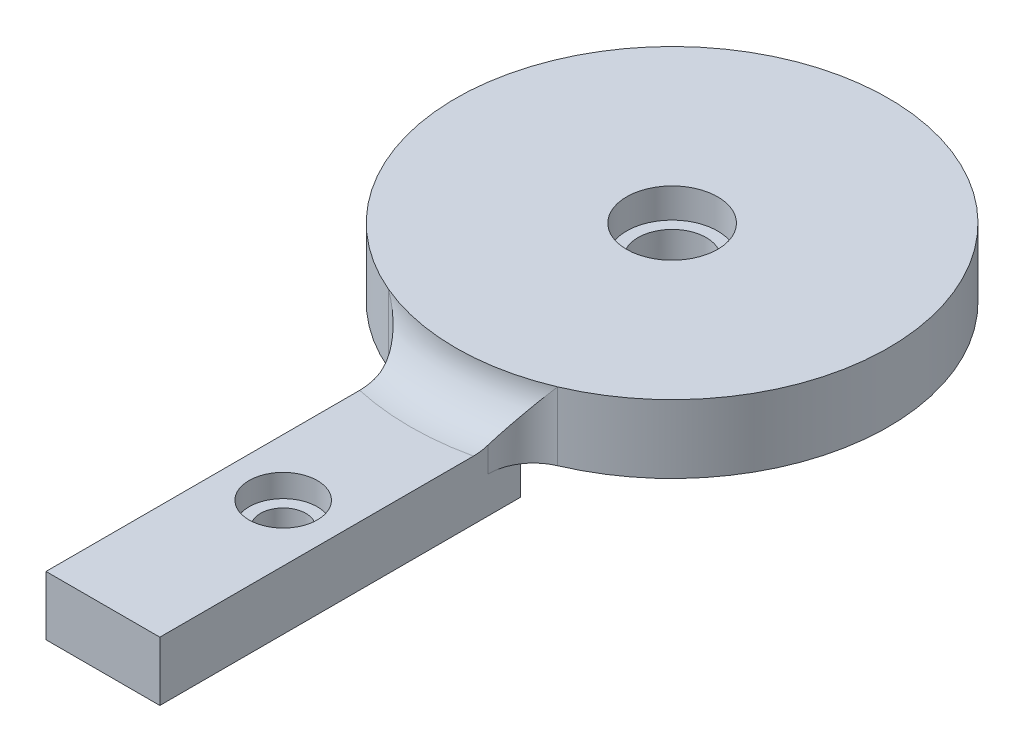
ISO-10303-21;
HEADER;
FILE_DESCRIPTION(('STEP AP214'),'2;1');
FILE_NAME('part.step','',(''),(''),'','','');
FILE_SCHEMA(('AUTOMOTIVE_DESIGN { 1 0 10303 214 1 1 1 1 }'));
ENDSEC;
DATA;
#1=APPLICATION_CONTEXT('core data for automotive mechanical design processes');
#2=APPLICATION_PROTOCOL_DEFINITION('international standard','automotive_design',2000,#1);
#3=PRODUCT_CONTEXT('',#1,'mechanical');
#4=PRODUCT('Part','Part','',(#3));
#5=PRODUCT_RELATED_PRODUCT_CATEGORY('part','',(#4));
#6=PRODUCT_DEFINITION_FORMATION('','',#4);
#7=PRODUCT_DEFINITION_CONTEXT('part definition',#1,'design');
#8=PRODUCT_DEFINITION('design','',#6,#7);
#9=PRODUCT_DEFINITION_SHAPE('','',#8);
#10=(LENGTH_UNIT() NAMED_UNIT(*) SI_UNIT(.MILLI.,.METRE.));
#11=(NAMED_UNIT(*) PLANE_ANGLE_UNIT() SI_UNIT($,.RADIAN.));
#12=(NAMED_UNIT(*) SI_UNIT($,.STERADIAN.) SOLID_ANGLE_UNIT());
#13=UNCERTAINTY_MEASURE_WITH_UNIT(LENGTH_MEASURE(1.E-05),#10,'distance_accuracy_value','');
#14=(GEOMETRIC_REPRESENTATION_CONTEXT(3) GLOBAL_UNCERTAINTY_ASSIGNED_CONTEXT((#13)) GLOBAL_UNIT_ASSIGNED_CONTEXT((#10,
#11,#12)) REPRESENTATION_CONTEXT('',''));
#15=CARTESIAN_POINT('',(0.,0.,0.));
#16=DIRECTION('',(0.,0.,1.));
#17=DIRECTION('',(1.,0.,0.));
#18=AXIS2_PLACEMENT_3D('',#15,#16,#17);
#19=CARTESIAN_POINT('',(0.,3.,0.));
#20=DIRECTION('',(0.,-1.,0.));
#21=DIRECTION('',(0.,0.,-1.));
#22=AXIS2_PLACEMENT_3D('',#19,#20,#21);
#23=CYLINDRICAL_SURFACE('',#22,9.5);
#24=CARTESIAN_POINT('',(0.,3.,0.));
#25=DIRECTION('',(0.,1.,0.));
#26=DIRECTION('',(0.,0.,1.));
#27=AXIS2_PLACEMENT_3D('',#24,#25,#26);
#28=CIRCLE('',#27,9.5);
#29=CARTESIAN_POINT('',(3.71739130434783,3.,8.742482593083));
#30=VERTEX_POINT('',#29);
#31=CARTESIAN_POINT('',(-3.71739130434783,3.,8.742482593083));
#32=VERTEX_POINT('',#31);
#33=EDGE_CURVE('E158',#30,#32,#28,.T.);
#34=ORIENTED_EDGE('',*,*,#33,.F.);
#35=DIRECTION('',(0.,-1.,0.));
#36=VECTOR('',#35,1.);
#37=CARTESIAN_POINT('',(3.71739130434783,3.,8.742482593083));
#38=LINE('',#37,#36);
#39=CARTESIAN_POINT('',(3.71739130434783,0.,8.742482593083));
#40=VERTEX_POINT('',#39);
#41=EDGE_CURVE('E237',#30,#40,#38,.T.);
#42=ORIENTED_EDGE('',*,*,#41,.T.);
#43=CARTESIAN_POINT('',(0.,0.,0.));
#44=DIRECTION('',(0.,1.,0.));
#45=DIRECTION('',(0.,0.,1.));
#46=AXIS2_PLACEMENT_3D('',#43,#44,#45);
#47=CIRCLE('',#46,9.5);
#48=CARTESIAN_POINT('',(-3.71739130434783,0.,8.742482593083));
#49=VERTEX_POINT('',#48);
#50=EDGE_CURVE('E163',#40,#49,#47,.T.);
#51=ORIENTED_EDGE('',*,*,#50,.T.);
#52=DIRECTION('',(0.,-1.,0.));
#53=VECTOR('',#52,1.);
#54=CARTESIAN_POINT('',(-3.71739130434783,3.,8.742482593083));
#55=LINE('',#54,#53);
#56=EDGE_CURVE('E240',#49,#32,#55,.F.);
#57=ORIENTED_EDGE('',*,*,#56,.T.);
#58=EDGE_LOOP('',(#34,#42,#51,#57));
#59=FACE_BOUND('',#58,.T.);
#60=ADVANCED_FACE('F41',(#59),#23,.T.);
#61=CARTESIAN_POINT('',(0.,3.,0.));
#62=DIRECTION('',(0.,1.,0.));
#63=DIRECTION('',(0.,0.,1.));
#64=AXIS2_PLACEMENT_3D('',#61,#62,#63);
#65=PLANE('',#64);
#66=CARTESIAN_POINT('',(0.,3.,0.));
#67=DIRECTION('',(0.,1.,0.));
#68=DIRECTION('',(0.,0.,1.));
#69=AXIS2_PLACEMENT_3D('',#66,#67,#68);
#70=CIRCLE('',#69,2.);
#71=CARTESIAN_POINT('',(0.,3.,2.));
#72=VERTEX_POINT('',#71);
#73=EDGE_CURVE('E137',#72,#72,#70,.T.);
#74=ORIENTED_EDGE('',*,*,#73,.F.);
#75=EDGE_LOOP('',(#74));
#76=FACE_BOUND('',#75,.T.);
#77=EDGE_CURVE('E162',#32,#30,#28,.T.);
#78=ORIENTED_EDGE('',*,*,#77,.T.);
#79=ORIENTED_EDGE('',*,*,#33,.T.);
#80=EDGE_LOOP('',(#78,#79));
#81=FACE_BOUND('',#80,.T.);
#82=ADVANCED_FACE('F222',(#76,#81),#65,.T.);
#83=CARTESIAN_POINT('',(0.,0.,0.));
#84=DIRECTION('',(0.,1.,0.));
#85=DIRECTION('',(0.,0.,1.));
#86=AXIS2_PLACEMENT_3D('',#83,#84,#85);
#87=PLANE('',#86);
#88=CARTESIAN_POINT('',(0.,0.,0.));
#89=DIRECTION('',(0.,-1.,0.));
#90=DIRECTION('',(0.,0.,-1.));
#91=AXIS2_PLACEMENT_3D('',#88,#89,#90);
#92=CIRCLE('',#91,7.6);
#93=CARTESIAN_POINT('',(0.,0.,-7.6));
#94=VERTEX_POINT('',#93);
#95=EDGE_CURVE('E117',#94,#94,#92,.T.);
#96=ORIENTED_EDGE('',*,*,#95,.F.);
#97=EDGE_LOOP('',(#96));
#98=FACE_BOUND('',#97,.T.);
#99=ORIENTED_EDGE('',*,*,#50,.F.);
#100=CARTESIAN_POINT('',(4.5,0.,10.5830052442584));
#101=DIRECTION('',(0.,1.,0.));
#102=DIRECTION('',(0.,0.,1.));
#103=AXIS2_PLACEMENT_3D('',#100,#101,#102);
#104=CIRCLE('',#103,2.);
#105=CARTESIAN_POINT('',(2.5,0.,10.5830052442584));
#106=VERTEX_POINT('',#105);
#107=EDGE_CURVE('E251',#40,#106,#104,.T.);
#108=ORIENTED_EDGE('',*,*,#107,.T.);
#109=DIRECTION('',(0.,0.,1.));
#110=VECTOR('',#109,1.);
#111=CARTESIAN_POINT('',(2.5,0.,0.));
#112=LINE('',#111,#110);
#113=CARTESIAN_POINT('',(2.5,0.,9.16515138991168));
#114=VERTEX_POINT('',#113);
#115=EDGE_CURVE('E59',#114,#106,#112,.T.);
#116=ORIENTED_EDGE('',*,*,#115,.F.);
#117=CARTESIAN_POINT('',(-2.5,0.,9.16515138991168));
#118=VERTEX_POINT('',#117);
#119=EDGE_CURVE('E115',#118,#114,#47,.T.);
#120=ORIENTED_EDGE('',*,*,#119,.F.);
#121=DIRECTION('',(0.,0.,-1.));
#122=VECTOR('',#121,1.);
#123=CARTESIAN_POINT('',(-2.5,0.,0.));
#124=LINE('',#123,#122);
#125=CARTESIAN_POINT('',(-2.5,0.,10.5830052442584));
#126=VERTEX_POINT('',#125);
#127=EDGE_CURVE('E256',#126,#118,#124,.T.);
#128=ORIENTED_EDGE('',*,*,#127,.F.);
#129=CARTESIAN_POINT('',(-4.5,0.,10.5830052442584));
#130=DIRECTION('',(0.,1.,0.));
#131=DIRECTION('',(0.,0.,1.));
#132=AXIS2_PLACEMENT_3D('',#129,#130,#131);
#133=CIRCLE('',#132,2.);
#134=EDGE_CURVE('E11',#126,#49,#133,.T.);
#135=ORIENTED_EDGE('',*,*,#134,.T.);
#136=EDGE_LOOP('',(#99,#108,#116,#120,#128,#135));
#137=FACE_BOUND('',#136,.T.);
#138=ADVANCED_FACE('F220',(#98,#137),#87,.F.);
#139=CARTESIAN_POINT('',(0.,0.5,0.));
#140=DIRECTION('',(0.,-1.,0.));
#141=DIRECTION('',(0.,0.,-1.));
#142=AXIS2_PLACEMENT_3D('',#139,#140,#141);
#143=CYLINDRICAL_SURFACE('',#142,7.6);
#144=CARTESIAN_POINT('',(0.,0.5,0.));
#145=DIRECTION('',(0.,-1.,0.));
#146=DIRECTION('',(0.,0.,-1.));
#147=AXIS2_PLACEMENT_3D('',#144,#145,#146);
#148=CIRCLE('',#147,7.6);
#149=CARTESIAN_POINT('',(0.,0.5,-7.6));
#150=VERTEX_POINT('',#149);
#151=EDGE_CURVE('E153',#150,#150,#148,.T.);
#152=ORIENTED_EDGE('',*,*,#151,.F.);
#153=EDGE_LOOP('',(#152));
#154=FACE_BOUND('',#153,.T.);
#155=ORIENTED_EDGE('',*,*,#95,.T.);
#156=EDGE_LOOP('',(#155));
#157=FACE_BOUND('',#156,.T.);
#158=ADVANCED_FACE('F216',(#154,#157),#143,.F.);
#159=CARTESIAN_POINT('',(0.,0.5,0.));
#160=DIRECTION('',(0.,-1.,0.));
#161=DIRECTION('',(0.,0.,-1.));
#162=AXIS2_PLACEMENT_3D('',#159,#160,#161);
#163=PLANE('',#162);
#164=CARTESIAN_POINT('',(0.,0.5,0.));
#165=DIRECTION('',(0.,-1.,0.));
#166=DIRECTION('',(0.,0.,-1.));
#167=AXIS2_PLACEMENT_3D('',#164,#165,#166);
#168=CIRCLE('',#167,1.5);
#169=CARTESIAN_POINT('',(0.,0.5,-1.5));
#170=VERTEX_POINT('',#169);
#171=EDGE_CURVE('E169',#170,#170,#168,.T.);
#172=ORIENTED_EDGE('',*,*,#171,.F.);
#173=EDGE_LOOP('',(#172));
#174=FACE_BOUND('',#173,.T.);
#175=ORIENTED_EDGE('',*,*,#151,.T.);
#176=EDGE_LOOP('',(#175));
#177=FACE_BOUND('',#176,.T.);
#178=ADVANCED_FACE('F213',(#174,#177),#163,.T.);
#179=CARTESIAN_POINT('',(0.,-1.6,0.));
#180=DIRECTION('',(0.,1.,0.));
#181=DIRECTION('',(0.,0.,1.));
#182=AXIS2_PLACEMENT_3D('',#179,#180,#181);
#183=CYLINDRICAL_SURFACE('',#182,9.5);
#184=ORIENTED_EDGE('',*,*,#119,.T.);
#185=DIRECTION('',(0.,1.,0.));
#186=VECTOR('',#185,1.);
#187=CARTESIAN_POINT('',(2.5,-1.6,9.16515138991168));
#188=LINE('',#187,#186);
#189=CARTESIAN_POINT('',(2.5,-1.6,9.16515138991168));
#190=VERTEX_POINT('',#189);
#191=EDGE_CURVE('E108',#190,#114,#188,.T.);
#192=ORIENTED_EDGE('',*,*,#191,.F.);
#193=CARTESIAN_POINT('',(0.,-1.6,0.));
#194=DIRECTION('',(0.,-1.,0.));
#195=DIRECTION('',(0.,0.,-1.));
#196=AXIS2_PLACEMENT_3D('',#193,#194,#195);
#197=CIRCLE('',#196,9.5);
#198=CARTESIAN_POINT('',(-2.5,-1.6,9.16515138991168));
#199=VERTEX_POINT('',#198);
#200=EDGE_CURVE('E113',#190,#199,#197,.T.);
#201=ORIENTED_EDGE('',*,*,#200,.T.);
#202=DIRECTION('',(0.,1.,0.));
#203=VECTOR('',#202,1.);
#204=CARTESIAN_POINT('',(-2.5,-1.6,9.16515138991168));
#205=LINE('',#204,#203);
#206=EDGE_CURVE('E142',#199,#118,#205,.T.);
#207=ORIENTED_EDGE('',*,*,#206,.T.);
#208=EDGE_LOOP('',(#184,#192,#201,#207));
#209=FACE_BOUND('',#208,.T.);
#210=ADVANCED_FACE('F110',(#209),#183,.F.);
#211=CARTESIAN_POINT('',(2.5,-1.6,0.));
#212=DIRECTION('',(-1.,0.,0.));
#213=DIRECTION('',(0.,0.,1.));
#214=AXIS2_PLACEMENT_3D('',#211,#212,#213);
#215=PLANE('',#214);
#216=ORIENTED_EDGE('',*,*,#115,.T.);
#217=DIRECTION('',(0.,1.,0.));
#218=VECTOR('',#217,1.);
#219=CARTESIAN_POINT('',(2.5,3.,10.5830052442584));
#220=LINE('',#219,#218);
#221=CARTESIAN_POINT('',(2.5,1.10040097238581,10.5830052442584));
#222=VERTEX_POINT('',#221);
#223=EDGE_CURVE('E259',#106,#222,#220,.T.);
#224=ORIENTED_EDGE('',*,*,#223,.T.);
#225=CARTESIAN_POINT('',(2.5,3.,9.16515138991168));
#226=CARTESIAN_POINT('',(2.5,2.94507948967621,9.16515048175511));
#227=CARTESIAN_POINT('',(2.5,2.89018591560524,9.16749780190774));
#228=CARTESIAN_POINT('',(2.5,2.78080468785167,9.17685365674659));
#229=CARTESIAN_POINT('',(2.5,2.72631698136846,9.18386157402017));
#230=CARTESIAN_POINT('',(2.5,2.56426323291039,9.21177358475455));
#231=CARTESIAN_POINT('',(2.5,2.45780396812137,9.23956638078001));
#232=CARTESIAN_POINT('',(2.5,2.25109972983604,9.31256230521273));
#233=CARTESIAN_POINT('',(2.5,2.1508551906533,9.3577666488302));
#234=CARTESIAN_POINT('',(2.5,1.95917981073917,9.46409101336274));
#235=CARTESIAN_POINT('',(2.5,1.86775031263618,9.52521345354943));
#236=CARTESIAN_POINT('',(2.5,1.6945785857672,9.6626335108321));
#237=CARTESIAN_POINT('',(2.5,1.61302674270591,9.73917070309158));
#238=CARTESIAN_POINT('',(2.5,1.46342673767224,9.90448170829992));
#239=CARTESIAN_POINT('',(2.5,1.39538216234534,9.99325876077783));
#240=CARTESIAN_POINT('',(2.5,1.27246764110905,10.1835802398452));
#241=CARTESIAN_POINT('',(2.5,1.21809120196434,10.2854432186382));
#242=CARTESIAN_POINT('',(2.5,1.12679127317599,10.496696281118));
#243=CARTESIAN_POINT('',(2.5,1.08986292590693,10.6060842600846));
#244=CARTESIAN_POINT('',(2.5,1.04150387807019,10.8006361748785));
#245=CARTESIAN_POINT('',(2.5,1.02595979460194,10.884802842851));
#246=CARTESIAN_POINT('',(2.5,1.00520657592899,11.0542933628545));
#247=CARTESIAN_POINT('',(2.5,0.999984556889041,11.1396156382978));
#248=CARTESIAN_POINT('',(2.5,1.,11.2249721603218));
#249=B_SPLINE_CURVE_WITH_KNOTS('',3,(#225,#226,#227,#228,#229,#230,#231,#232,#233,#234,#235,
#236,#237,#238,#239,#240,#241,#242,#243,#244,#245,#246,#247,#248),.UNSPECIFIED.,.F.,.F.,(4,2,2,
2,2,2,2,2,2,2,2,4),(0.,0.164658231389705,0.329294654022611,0.657671501485732,0.986071271622932,
1.31452098192498,1.64853582294687,1.9826392381368,2.32747665339377,2.67221800774815,
2.92838367390356,3.18422939576872),.UNSPECIFIED.);
#250=CARTESIAN_POINT('',(2.5,1.,11.2249721603218));
#251=VERTEX_POINT('',#250);
#252=EDGE_CURVE('E187',#222,#251,#249,.T.);
#253=ORIENTED_EDGE('',*,*,#252,.T.);
#254=DIRECTION('',(0.,0.,1.));
#255=VECTOR('',#254,1.);
#256=CARTESIAN_POINT('',(2.5,1.,0.));
#257=LINE('',#256,#255);
#258=CARTESIAN_POINT('',(2.5,1.,25.));
#259=VERTEX_POINT('',#258);
#260=EDGE_CURVE('E143',#251,#259,#257,.T.);
#261=ORIENTED_EDGE('',*,*,#260,.T.);
#262=DIRECTION('',(0.,1.,0.));
#263=VECTOR('',#262,1.);
#264=CARTESIAN_POINT('',(2.5,-1.6,25.));
#265=LINE('',#264,#263);
#266=CARTESIAN_POINT('',(2.5,-1.6,25.));
#267=VERTEX_POINT('',#266);
#268=EDGE_CURVE('E118',#267,#259,#265,.T.);
#269=ORIENTED_EDGE('',*,*,#268,.F.);
#270=DIRECTION('',(0.,0.,1.));
#271=VECTOR('',#270,1.);
#272=CARTESIAN_POINT('',(2.5,-1.6,0.));
#273=LINE('',#272,#271);
#274=EDGE_CURVE('E121',#190,#267,#273,.T.);
#275=ORIENTED_EDGE('',*,*,#274,.F.);
#276=ORIENTED_EDGE('',*,*,#191,.T.);
#277=EDGE_LOOP('',(#216,#224,#253,#261,#269,#275,#276));
#278=FACE_BOUND('',#277,.T.);
#279=ADVANCED_FACE('F122',(#278),#215,.F.);
#280=CARTESIAN_POINT('',(0.,-1.6,25.));
#281=DIRECTION('',(0.,0.,1.));
#282=DIRECTION('',(1.,0.,0.));
#283=AXIS2_PLACEMENT_3D('',#280,#281,#282);
#284=PLANE('',#283);
#285=DIRECTION('',(1.,0.,0.));
#286=VECTOR('',#285,1.);
#287=CARTESIAN_POINT('',(0.,1.,25.));
#288=LINE('',#287,#286);
#289=CARTESIAN_POINT('',(-2.5,1.,25.));
#290=VERTEX_POINT('',#289);
#291=EDGE_CURVE('E134',#290,#259,#288,.T.);
#292=ORIENTED_EDGE('',*,*,#291,.F.);
#293=DIRECTION('',(0.,1.,0.));
#294=VECTOR('',#293,1.);
#295=CARTESIAN_POINT('',(-2.5,-1.6,25.));
#296=LINE('',#295,#294);
#297=CARTESIAN_POINT('',(-2.5,-1.6,25.));
#298=VERTEX_POINT('',#297);
#299=EDGE_CURVE('E149',#298,#290,#296,.T.);
#300=ORIENTED_EDGE('',*,*,#299,.F.);
#301=DIRECTION('',(1.,0.,0.));
#302=VECTOR('',#301,1.);
#303=CARTESIAN_POINT('',(0.,-1.6,25.));
#304=LINE('',#303,#302);
#305=EDGE_CURVE('E127',#298,#267,#304,.T.);
#306=ORIENTED_EDGE('',*,*,#305,.T.);
#307=ORIENTED_EDGE('',*,*,#268,.T.);
#308=EDGE_LOOP('',(#292,#300,#306,#307));
#309=FACE_BOUND('',#308,.T.);
#310=ADVANCED_FACE('F202',(#309),#284,.T.);
#311=CARTESIAN_POINT('',(-2.5,-1.6,0.));
#312=DIRECTION('',(-1.,0.,0.));
#313=DIRECTION('',(0.,0.,1.));
#314=AXIS2_PLACEMENT_3D('',#311,#312,#313);
#315=PLANE('',#314);
#316=CARTESIAN_POINT('',(-2.5,1.,11.2249721603218));
#317=CARTESIAN_POINT('',(-2.5,1.00000105718365,11.1659064639501));
#318=CARTESIAN_POINT('',(-2.5,1.00249435344201,11.106869631491));
#319=CARTESIAN_POINT('',(-2.5,1.01243445169751,10.9892169178784));
#320=CARTESIAN_POINT('',(-2.5,1.0198810489431,10.9306010194261));
#321=CARTESIAN_POINT('',(-2.5,1.0495822076744,10.7560540518627));
#322=CARTESIAN_POINT('',(-2.5,1.07919829099557,10.6412883033866));
#323=CARTESIAN_POINT('',(-2.5,1.15727625916211,10.4183508634756));
#324=CARTESIAN_POINT('',(-2.5,1.20574788253638,10.3101826129733));
#325=CARTESIAN_POINT('',(-2.5,1.32027896512709,10.1036004758037));
#326=CARTESIAN_POINT('',(-2.5,1.38633381520257,10.0051840421293));
#327=CARTESIAN_POINT('',(-2.5,1.53377919711974,9.82176586312826));
#328=CARTESIAN_POINT('',(-2.5,1.6150552915134,9.73667219492719));
#329=CARTESIAN_POINT('',(-2.5,1.79110927376422,9.58176647397337));
#330=CARTESIAN_POINT('',(-2.5,1.88588857138797,9.51195601875728));
#331=CARTESIAN_POINT('',(-2.5,2.08359101628214,9.39167102590288));
#332=CARTESIAN_POINT('',(-2.5,2.18623428946876,9.34073608223342));
#333=CARTESIAN_POINT('',(-2.5,2.39877131830615,9.25752004144949));
#334=CARTESIAN_POINT('',(-2.5,2.50865697168293,9.22521848042353));
#335=CARTESIAN_POINT('',(-2.5,2.68292303391411,9.19030106898049));
#336=CARTESIAN_POINT('',(-2.5,2.7460116192046,9.18087611833152));
#337=CARTESIAN_POINT('',(-2.5,2.87272266164224,9.16830326305873));
#338=CARTESIAN_POINT('',(-2.5,2.93634425866494,9.16514668550634));
#339=CARTESIAN_POINT('',(-2.5,3.,9.16515138991168));
#340=B_SPLINE_CURVE_WITH_KNOTS('',3,(#316,#317,#318,#319,#320,#321,#322,#323,#324,#325,#326,
#327,#328,#329,#330,#331,#332,#333,#334,#335,#336,#337,#338,#339),.UNSPECIFIED.,.F.,.F.,(4,2,2,
2,2,2,2,2,2,2,2,4),(0.,0.177087491450069,0.354167663198444,0.707926929864555,1.0618691495899,
1.41571868064956,1.76700754271795,2.11833310709275,2.46041525188767,2.80212098987973,
2.99320787399041,3.1840301853339),.UNSPECIFIED.);
#341=CARTESIAN_POINT('',(-2.5,1.,11.2249721603218));
#342=VERTEX_POINT('',#341);
#343=CARTESIAN_POINT('',(-2.5,1.10040097238581,10.5830052442584));
#344=VERTEX_POINT('',#343);
#345=EDGE_CURVE('E178',#342,#344,#340,.T.);
#346=ORIENTED_EDGE('',*,*,#345,.T.);
#347=DIRECTION('',(0.,-1.,0.));
#348=VECTOR('',#347,1.);
#349=CARTESIAN_POINT('',(-2.5,-1.6,10.5830052442584));
#350=LINE('',#349,#348);
#351=EDGE_CURVE('E252',#344,#126,#350,.T.);
#352=ORIENTED_EDGE('',*,*,#351,.T.);
#353=ORIENTED_EDGE('',*,*,#127,.T.);
#354=ORIENTED_EDGE('',*,*,#206,.F.);
#355=DIRECTION('',(0.,0.,1.));
#356=VECTOR('',#355,1.);
#357=CARTESIAN_POINT('',(-2.5,-1.6,0.));
#358=LINE('',#357,#356);
#359=EDGE_CURVE('E131',#199,#298,#358,.T.);
#360=ORIENTED_EDGE('',*,*,#359,.T.);
#361=ORIENTED_EDGE('',*,*,#299,.T.);
#362=DIRECTION('',(0.,0.,1.));
#363=VECTOR('',#362,1.);
#364=CARTESIAN_POINT('',(-2.5,1.,0.));
#365=LINE('',#364,#363);
#366=EDGE_CURVE('E132',#342,#290,#365,.T.);
#367=ORIENTED_EDGE('',*,*,#366,.F.);
#368=EDGE_LOOP('',(#346,#352,#353,#354,#360,#361,#367));
#369=FACE_BOUND('',#368,.T.);
#370=ADVANCED_FACE('F197',(#369),#315,.T.);
#371=CARTESIAN_POINT('',(0.,-1.6,0.));
#372=DIRECTION('',(0.,-1.,0.));
#373=DIRECTION('',(0.,0.,-1.));
#374=AXIS2_PLACEMENT_3D('',#371,#372,#373);
#375=PLANE('',#374);
#376=CARTESIAN_POINT('',(0.,-1.6,17.0825756949558));
#377=DIRECTION('',(0.,1.,0.));
#378=DIRECTION('',(0.,0.,1.));
#379=AXIS2_PLACEMENT_3D('',#376,#377,#378);
#380=CIRCLE('',#379,1.);
#381=CARTESIAN_POINT('',(0.,-1.6,18.0825756949558));
#382=VERTEX_POINT('',#381);
#383=EDGE_CURVE('E175',#382,#382,#380,.T.);
#384=ORIENTED_EDGE('',*,*,#383,.T.);
#385=EDGE_LOOP('',(#384));
#386=FACE_BOUND('',#385,.T.);
#387=ORIENTED_EDGE('',*,*,#200,.F.);
#388=ORIENTED_EDGE('',*,*,#274,.T.);
#389=ORIENTED_EDGE('',*,*,#305,.F.);
#390=ORIENTED_EDGE('',*,*,#359,.F.);
#391=EDGE_LOOP('',(#387,#388,#389,#390));
#392=FACE_BOUND('',#391,.T.);
#393=ADVANCED_FACE('F129',(#386,#392),#375,.T.);
#394=CARTESIAN_POINT('',(0.,1.,0.));
#395=DIRECTION('',(0.,-1.,0.));
#396=DIRECTION('',(0.,0.,-1.));
#397=AXIS2_PLACEMENT_3D('',#394,#395,#396);
#398=PLANE('',#397);
#399=CARTESIAN_POINT('',(0.,1.,17.0825756949558));
#400=DIRECTION('',(0.,1.,0.));
#401=DIRECTION('',(0.,0.,1.));
#402=AXIS2_PLACEMENT_3D('',#399,#400,#401);
#403=CIRCLE('',#402,1.5);
#404=CARTESIAN_POINT('',(0.,1.,18.5825756949558));
#405=VERTEX_POINT('',#404);
#406=EDGE_CURVE('E174',#405,#405,#403,.T.);
#407=ORIENTED_EDGE('',*,*,#406,.F.);
#408=EDGE_LOOP('',(#407));
#409=FACE_BOUND('',#408,.T.);
#410=ORIENTED_EDGE('',*,*,#260,.F.);
#411=CARTESIAN_POINT('',(0.,1.,0.));
#412=DIRECTION('',(0.,-1.,0.));
#413=DIRECTION('',(0.,0.,-1.));
#414=AXIS2_PLACEMENT_3D('',#411,#412,#413);
#415=CIRCLE('',#414,11.5);
#416=EDGE_CURVE('E161',#251,#342,#415,.T.);
#417=ORIENTED_EDGE('',*,*,#416,.T.);
#418=ORIENTED_EDGE('',*,*,#366,.T.);
#419=ORIENTED_EDGE('',*,*,#291,.T.);
#420=EDGE_LOOP('',(#410,#417,#418,#419));
#421=FACE_BOUND('',#420,.T.);
#422=ADVANCED_FACE('F204',(#409,#421),#398,.F.);
#423=CARTESIAN_POINT('',(0.,1.7,0.));
#424=DIRECTION('',(0.,1.,0.));
#425=DIRECTION('',(0.,0.,1.));
#426=AXIS2_PLACEMENT_3D('',#423,#424,#425);
#427=CYLINDRICAL_SURFACE('',#426,2.);
#428=CARTESIAN_POINT('',(0.,1.7,0.));
#429=DIRECTION('',(0.,1.,0.));
#430=DIRECTION('',(0.,0.,1.));
#431=AXIS2_PLACEMENT_3D('',#428,#429,#430);
#432=CIRCLE('',#431,2.);
#433=CARTESIAN_POINT('',(0.,1.7,2.));
#434=VERTEX_POINT('',#433);
#435=EDGE_CURVE('E145',#434,#434,#432,.T.);
#436=ORIENTED_EDGE('',*,*,#435,.F.);
#437=EDGE_LOOP('',(#436));
#438=FACE_BOUND('',#437,.T.);
#439=ORIENTED_EDGE('',*,*,#73,.T.);
#440=EDGE_LOOP('',(#439));
#441=FACE_BOUND('',#440,.T.);
#442=ADVANCED_FACE('F301',(#438,#441),#427,.F.);
#443=CARTESIAN_POINT('',(0.,1.7,0.));
#444=DIRECTION('',(0.,1.,0.));
#445=DIRECTION('',(0.,0.,1.));
#446=AXIS2_PLACEMENT_3D('',#443,#444,#445);
#447=PLANE('',#446);
#448=CARTESIAN_POINT('',(0.,1.7,0.));
#449=DIRECTION('',(0.,1.,0.));
#450=DIRECTION('',(0.,0.,1.));
#451=AXIS2_PLACEMENT_3D('',#448,#449,#450);
#452=CIRCLE('',#451,1.5);
#453=CARTESIAN_POINT('',(0.,1.7,1.5));
#454=VERTEX_POINT('',#453);
#455=EDGE_CURVE('E166',#454,#454,#452,.T.);
#456=ORIENTED_EDGE('',*,*,#455,.F.);
#457=EDGE_LOOP('',(#456));
#458=FACE_BOUND('',#457,.T.);
#459=ORIENTED_EDGE('',*,*,#435,.T.);
#460=EDGE_LOOP('',(#459));
#461=FACE_BOUND('',#460,.T.);
#462=ADVANCED_FACE('F297',(#458,#461),#447,.T.);
#463=CARTESIAN_POINT('',(0.,-1.6,0.));
#464=DIRECTION('',(0.,1.,0.));
#465=DIRECTION('',(0.,0.,1.));
#466=AXIS2_PLACEMENT_3D('',#463,#464,#465);
#467=CYLINDRICAL_SURFACE('',#466,1.5);
#468=ORIENTED_EDGE('',*,*,#171,.T.);
#469=EDGE_LOOP('',(#468));
#470=FACE_BOUND('',#469,.T.);
#471=ORIENTED_EDGE('',*,*,#455,.T.);
#472=EDGE_LOOP('',(#471));
#473=FACE_BOUND('',#472,.T.);
#474=ADVANCED_FACE('F293',(#470,#473),#467,.F.);
#475=CARTESIAN_POINT('',(0.,0.,17.0825756949558));
#476=DIRECTION('',(0.,1.,0.));
#477=DIRECTION('',(0.,0.,1.));
#478=AXIS2_PLACEMENT_3D('',#475,#476,#477);
#479=CYLINDRICAL_SURFACE('',#478,1.5);
#480=CARTESIAN_POINT('',(0.,0.,17.0825756949558));
#481=DIRECTION('',(0.,1.,0.));
#482=DIRECTION('',(0.,0.,1.));
#483=AXIS2_PLACEMENT_3D('',#480,#481,#482);
#484=CIRCLE('',#483,1.5);
#485=CARTESIAN_POINT('',(0.,0.,18.5825756949558));
#486=VERTEX_POINT('',#485);
#487=EDGE_CURVE('E170',#486,#486,#484,.T.);
#488=ORIENTED_EDGE('',*,*,#487,.F.);
#489=EDGE_LOOP('',(#488));
#490=FACE_BOUND('',#489,.T.);
#491=ORIENTED_EDGE('',*,*,#406,.T.);
#492=EDGE_LOOP('',(#491));
#493=FACE_BOUND('',#492,.T.);
#494=ADVANCED_FACE('F286',(#490,#493),#479,.F.);
#495=CARTESIAN_POINT('',(0.,0.,17.0825756949558));
#496=DIRECTION('',(0.,1.,0.));
#497=DIRECTION('',(0.,0.,1.));
#498=AXIS2_PLACEMENT_3D('',#495,#496,#497);
#499=PLANE('',#498);
#500=CARTESIAN_POINT('',(0.,0.,17.0825756949558));
#501=DIRECTION('',(0.,1.,0.));
#502=DIRECTION('',(0.,0.,1.));
#503=AXIS2_PLACEMENT_3D('',#500,#501,#502);
#504=CIRCLE('',#503,1.);
#505=CARTESIAN_POINT('',(0.,0.,18.0825756949558));
#506=VERTEX_POINT('',#505);
#507=EDGE_CURVE('E171',#506,#506,#504,.T.);
#508=ORIENTED_EDGE('',*,*,#507,.F.);
#509=EDGE_LOOP('',(#508));
#510=FACE_BOUND('',#509,.T.);
#511=ORIENTED_EDGE('',*,*,#487,.T.);
#512=EDGE_LOOP('',(#511));
#513=FACE_BOUND('',#512,.T.);
#514=ADVANCED_FACE('F280',(#510,#513),#499,.T.);
#515=CARTESIAN_POINT('',(0.,-1.6,17.0825756949558));
#516=DIRECTION('',(0.,1.,0.));
#517=DIRECTION('',(0.,0.,1.));
#518=AXIS2_PLACEMENT_3D('',#515,#516,#517);
#519=CYLINDRICAL_SURFACE('',#518,1.);
#520=ORIENTED_EDGE('',*,*,#507,.T.);
#521=EDGE_LOOP('',(#520));
#522=FACE_BOUND('',#521,.T.);
#523=ORIENTED_EDGE('',*,*,#383,.F.);
#524=EDGE_LOOP('',(#523));
#525=FACE_BOUND('',#524,.T.);
#526=ADVANCED_FACE('F276',(#522,#525),#519,.F.);
#527=CARTESIAN_POINT('',(0.,3.,0.));
#528=DIRECTION('',(0.,-1.,0.));
#529=DIRECTION('',(0.,0.,-1.));
#530=AXIS2_PLACEMENT_3D('',#527,#528,#529);
#531=TOROIDAL_SURFACE('',#530,11.5,2.);
#532=ORIENTED_EDGE('',*,*,#252,.F.);
#533=CARTESIAN_POINT('',(2.5,1.10040097238581,10.5830052442584));
#534=CARTESIAN_POINT('',(2.49999564146918,1.11763446024936,10.5292236232451));
#535=CARTESIAN_POINT('',(2.50216903937744,1.13688034478315,10.4761565541412));
#536=CARTESIAN_POINT('',(2.51048823850976,1.17892886968234,10.3718947420129));
#537=CARTESIAN_POINT('',(2.51662565498789,1.20172392573123,10.3206962874147));
#538=CARTESIAN_POINT('',(2.54021670443882,1.27421169178821,10.1715566385364));
#539=CARTESIAN_POINT('',(2.56287020088772,1.32848551756573,10.0766347741123));
#540=CARTESIAN_POINT('',(2.62707648686471,1.46255853427813,9.87109253598866));
#541=CARTESIAN_POINT('',(2.67214562470833,1.54524930417944,9.76352195473472));
#542=CARTESIAN_POINT('',(2.77572003721486,1.72091550754699,9.5633739880979));
#543=CARTESIAN_POINT('',(2.83431327507759,1.81395611069494,9.47090184016883));
#544=CARTESIAN_POINT('',(2.94440388384011,1.98059131734702,9.32357906875198));
#545=CARTESIAN_POINT('',(2.99360484437174,2.05272778473743,9.26528254831383));
#546=CARTESIAN_POINT('',(3.09650809571771,2.19947985136824,9.15617746678376));
#547=CARTESIAN_POINT('',(3.1502127453072,2.2740967372056,9.10537286844191));
#548=CARTESIAN_POINT('',(3.26133810693612,2.42480905116095,9.01105879065731));
#549=CARTESIAN_POINT('',(3.31875053015947,2.5009009322231,8.96753377008113));
#550=CARTESIAN_POINT('',(3.43693591705149,2.6540489815639,8.88742602753727));
#551=CARTESIAN_POINT('',(3.49770737525475,2.73110470607325,8.85084022758577));
#552=CARTESIAN_POINT('',(3.60967519284654,2.86995550223268,8.79122277357224));
#553=CARTESIAN_POINT('',(3.66030953321809,2.93167157601464,8.76694741576861));
#554=CARTESIAN_POINT('',(3.71370172435984,2.99558742745211,8.74405471939427));
#555=CARTESIAN_POINT('',(3.71554593110501,2.99779372118647,8.74326726726193));
#556=CARTESIAN_POINT('',(3.71739130434783,3.,8.742482593083));
#557=B_SPLINE_CURVE_WITH_KNOTS('',3,(#533,#534,#535,#536,#537,#538,#539,#540,#541,#542,#543,
#544,#545,#546,#547,#548,#549,#550,#551,#552,#553,#554,#555,#556),.UNSPECIFIED.,.F.,.F.,(4,2,2,
2,2,2,2,2,2,2,2,4),(0.,0.169237507718537,0.33811820913454,0.67141223626886,1.09805973392608,
1.52756458076626,1.84214425729157,2.15688973417667,2.47095443954586,2.78487950986281,
3.0350480057109,3.04399228219699),.UNSPECIFIED.);
#558=EDGE_CURVE('E245',#222,#30,#557,.T.);
#559=ORIENTED_EDGE('',*,*,#558,.T.);
#560=ORIENTED_EDGE('',*,*,#77,.F.);
#561=CARTESIAN_POINT('',(-2.5,1.10040097238581,10.5830052442584));
#562=CARTESIAN_POINT('',(-2.49999564146918,1.11763446024936,10.5292236232451));
#563=CARTESIAN_POINT('',(-2.50216903937744,1.13688034478315,10.4761565541412));
#564=CARTESIAN_POINT('',(-2.51048823850976,1.17892886968234,10.3718947420129));
#565=CARTESIAN_POINT('',(-2.51662565498789,1.20172392573123,10.3206962874147));
#566=CARTESIAN_POINT('',(-2.54021670443882,1.27421169178821,10.1715566385364));
#567=CARTESIAN_POINT('',(-2.56287020088772,1.32848551756573,10.0766347741123));
#568=CARTESIAN_POINT('',(-2.62707648686471,1.46255853427813,9.87109253598866));
#569=CARTESIAN_POINT('',(-2.67214562470833,1.54524930417944,9.76352195473472));
#570=CARTESIAN_POINT('',(-2.77572003721486,1.72091550754699,9.5633739880979));
#571=CARTESIAN_POINT('',(-2.83431327507759,1.81395611069494,9.47090184016883));
#572=CARTESIAN_POINT('',(-2.94440388384011,1.98059131734702,9.32357906875198));
#573=CARTESIAN_POINT('',(-2.99360484437174,2.05272778473743,9.26528254831383));
#574=CARTESIAN_POINT('',(-3.09650809571771,2.19947985136824,9.15617746678376));
#575=CARTESIAN_POINT('',(-3.1502127453072,2.2740967372056,9.10537286844191));
#576=CARTESIAN_POINT('',(-3.26133810693612,2.42480905116095,9.01105879065731));
#577=CARTESIAN_POINT('',(-3.31875053015947,2.5009009322231,8.96753377008113));
#578=CARTESIAN_POINT('',(-3.43693591705149,2.6540489815639,8.88742602753727));
#579=CARTESIAN_POINT('',(-3.49770737525475,2.73110470607325,8.85084022758577));
#580=CARTESIAN_POINT('',(-3.60967519284654,2.86995550223268,8.79122277357224));
#581=CARTESIAN_POINT('',(-3.66030953321809,2.93167157601464,8.76694741576861));
#582=CARTESIAN_POINT('',(-3.71370172435984,2.99558742745211,8.74405471939427));
#583=CARTESIAN_POINT('',(-3.71554593110501,2.99779372118647,8.74326726726193));
#584=CARTESIAN_POINT('',(-3.71739130434783,3.,8.742482593083));
#585=B_SPLINE_CURVE_WITH_KNOTS('',3,(#561,#562,#563,#564,#565,#566,#567,#568,#569,#570,#571,
#572,#573,#574,#575,#576,#577,#578,#579,#580,#581,#582,#583,#584),.UNSPECIFIED.,.F.,.F.,(4,2,2,
2,2,2,2,2,2,2,2,4),(0.,0.169237507718537,0.33811820913454,0.67141223626886,1.09805973392608,
1.52756458076626,1.84214425729157,2.15688973417667,2.47095443954586,2.78487950986281,
3.0350480057109,3.04399228219699),.UNSPECIFIED.);
#586=EDGE_CURVE('E51',#32,#344,#585,.F.);
#587=ORIENTED_EDGE('',*,*,#586,.T.);
#588=ORIENTED_EDGE('',*,*,#345,.F.);
#589=ORIENTED_EDGE('',*,*,#416,.F.);
#590=EDGE_LOOP('',(#532,#559,#560,#587,#588,#589));
#591=FACE_BOUND('',#590,.T.);
#592=ADVANCED_FACE('F194',(#591),#531,.F.);
#593=CARTESIAN_POINT('',(4.5,3.,10.5830052442584));
#594=DIRECTION('',(0.,-1.,0.));
#595=DIRECTION('',(0.,0.,-1.));
#596=AXIS2_PLACEMENT_3D('',#593,#594,#595);
#597=CYLINDRICAL_SURFACE('',#596,2.);
#598=ORIENTED_EDGE('',*,*,#107,.F.);
#599=ORIENTED_EDGE('',*,*,#41,.F.);
#600=ORIENTED_EDGE('',*,*,#558,.F.);
#601=ORIENTED_EDGE('',*,*,#223,.F.);
#602=EDGE_LOOP('',(#598,#599,#600,#601));
#603=FACE_BOUND('',#602,.T.);
#604=ADVANCED_FACE('F255',(#603),#597,.F.);
#605=CARTESIAN_POINT('',(-4.5,3.,10.5830052442584));
#606=DIRECTION('',(0.,-1.,0.));
#607=DIRECTION('',(0.,0.,-1.));
#608=AXIS2_PLACEMENT_3D('',#605,#606,#607);
#609=CYLINDRICAL_SURFACE('',#608,2.);
#610=ORIENTED_EDGE('',*,*,#134,.F.);
#611=ORIENTED_EDGE('',*,*,#351,.F.);
#612=ORIENTED_EDGE('',*,*,#586,.F.);
#613=ORIENTED_EDGE('',*,*,#56,.F.);
#614=EDGE_LOOP('',(#610,#611,#612,#613));
#615=FACE_BOUND('',#614,.T.);
#616=ADVANCED_FACE('F43',(#615),#609,.F.);
#617=CLOSED_SHELL('',(#60,#82,#138,#158,#178,#210,#279,#310,#370,#393,#422,#442,#462,#474,#494,
#514,#526,#592,#604,#616));
#618=MANIFOLD_SOLID_BREP('B2',#617);
#619=ADVANCED_BREP_SHAPE_REPRESENTATION('',(#18,#618),#14);
#620=SHAPE_DEFINITION_REPRESENTATION(#9,#619);
ENDSEC;
END-ISO-10303-21;
